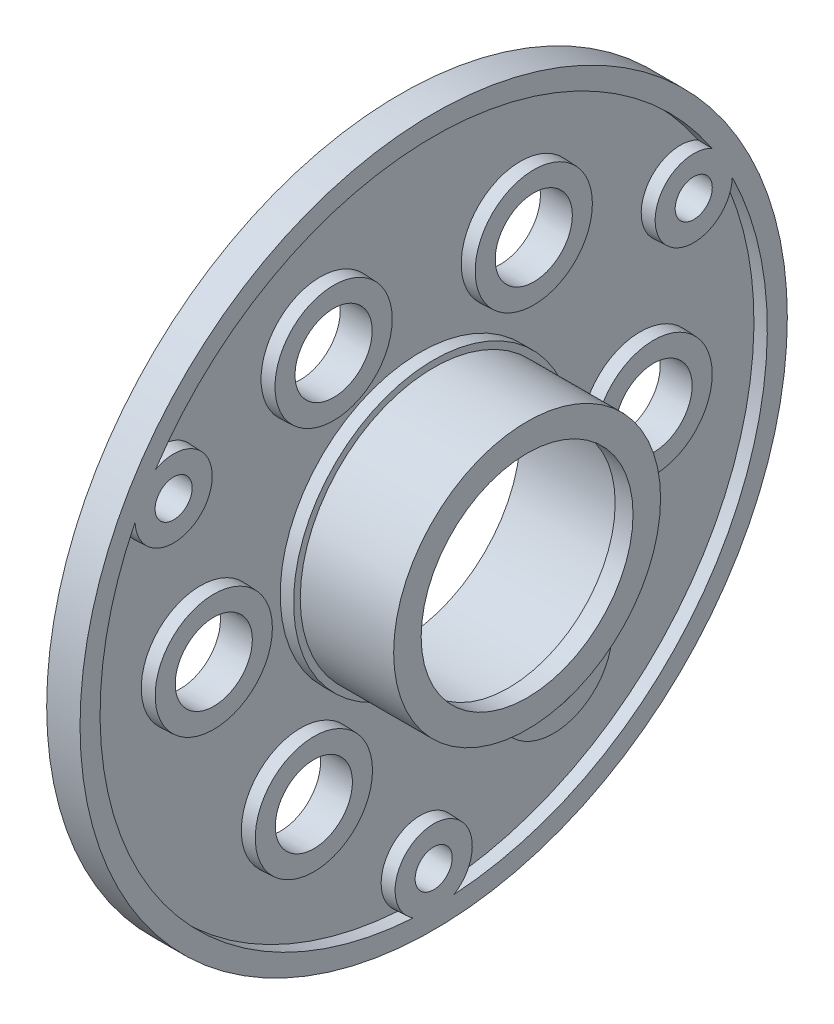
ISO-10303-21;
HEADER;
FILE_DESCRIPTION(('STEP AP214'),'2;1');
FILE_NAME('part.step','',(''),(''),'','','');
FILE_SCHEMA(('AUTOMOTIVE_DESIGN { 1 0 10303 214 1 1 1 1 }'));
ENDSEC;
DATA;
#1=APPLICATION_CONTEXT('core data for automotive mechanical design processes');
#2=APPLICATION_PROTOCOL_DEFINITION('international standard','automotive_design',2000,#1);
#3=PRODUCT_CONTEXT('',#1,'mechanical');
#4=PRODUCT('Part','Part','',(#3));
#5=PRODUCT_RELATED_PRODUCT_CATEGORY('part','',(#4));
#6=PRODUCT_DEFINITION_FORMATION('','',#4);
#7=PRODUCT_DEFINITION_CONTEXT('part definition',#1,'design');
#8=PRODUCT_DEFINITION('design','',#6,#7);
#9=PRODUCT_DEFINITION_SHAPE('','',#8);
#10=(LENGTH_UNIT() NAMED_UNIT(*) SI_UNIT(.MILLI.,.METRE.));
#11=(NAMED_UNIT(*) PLANE_ANGLE_UNIT() SI_UNIT($,.RADIAN.));
#12=(NAMED_UNIT(*) SI_UNIT($,.STERADIAN.) SOLID_ANGLE_UNIT());
#13=UNCERTAINTY_MEASURE_WITH_UNIT(LENGTH_MEASURE(1.E-05),#10,'distance_accuracy_value','');
#14=(GEOMETRIC_REPRESENTATION_CONTEXT(3) GLOBAL_UNCERTAINTY_ASSIGNED_CONTEXT((#13)) GLOBAL_UNIT_ASSIGNED_CONTEXT((#10,
#11,#12)) REPRESENTATION_CONTEXT('',''));
#15=CARTESIAN_POINT('',(0.,0.,0.));
#16=DIRECTION('',(0.,0.,1.));
#17=DIRECTION('',(1.,0.,0.));
#18=AXIS2_PLACEMENT_3D('',#15,#16,#17);
#19=CARTESIAN_POINT('',(1.25,0.,0.));
#20=DIRECTION('',(1.,0.,0.));
#21=DIRECTION('',(0.,0.,-1.));
#22=AXIS2_PLACEMENT_3D('',#19,#20,#21);
#23=PLANE('',#22);
#24=CARTESIAN_POINT('',(1.25,0.,0.));
#25=DIRECTION('',(1.,0.,0.));
#26=DIRECTION('',(0.,0.,-1.));
#27=AXIS2_PLACEMENT_3D('',#24,#25,#26);
#28=CIRCLE('',#27,10.);
#29=CARTESIAN_POINT('',(1.25,0.,-10.));
#30=VERTEX_POINT('',#29);
#31=EDGE_CURVE('E311',#30,#30,#28,.T.);
#32=ORIENTED_EDGE('',*,*,#31,.F.);
#33=EDGE_LOOP('',(#32));
#34=FACE_BOUND('',#33,.T.);
#35=CARTESIAN_POINT('',(1.25,0.,0.));
#36=DIRECTION('',(1.,0.,0.));
#37=DIRECTION('',(0.,0.,-1.));
#38=AXIS2_PLACEMENT_3D('',#35,#36,#37);
#39=CIRCLE('',#38,10.5);
#40=CARTESIAN_POINT('',(1.25,0.,-10.5));
#41=VERTEX_POINT('',#40);
#42=EDGE_CURVE('E98',#41,#41,#39,.T.);
#43=ORIENTED_EDGE('',*,*,#42,.T.);
#44=EDGE_LOOP('',(#43));
#45=FACE_BOUND('',#44,.T.);
#46=ADVANCED_FACE('F35',(#34,#45),#23,.T.);
#47=CARTESIAN_POINT('',(1.25,14.6969384566991,7.5));
#48=DIRECTION('',(1.,0.,0.));
#49=DIRECTION('',(0.,0.,-1.));
#50=AXIS2_PLACEMENT_3D('',#47,#48,#49);
#51=CIRCLE('',#50,2.89084764272872);
#52=CARTESIAN_POINT('',(1.25,14.6969384566991,4.60915235727128));
#53=VERTEX_POINT('',#52);
#54=EDGE_CURVE('E356',#53,#53,#51,.T.);
#55=ORIENTED_EDGE('',*,*,#54,.F.);
#56=EDGE_LOOP('',(#55));
#57=FACE_BOUND('',#56,.T.);
#58=CARTESIAN_POINT('',(1.25,14.6969384566991,7.5));
#59=DIRECTION('',(1.,0.,0.));
#60=DIRECTION('',(0.,0.,-1.));
#61=AXIS2_PLACEMENT_3D('',#58,#59,#60);
#62=CIRCLE('',#61,4.3922766704737);
#63=CARTESIAN_POINT('',(1.25,14.6969384566991,3.1077233295263));
#64=VERTEX_POINT('',#63);
#65=EDGE_CURVE('E150',#64,#64,#62,.T.);
#66=ORIENTED_EDGE('',*,*,#65,.T.);
#67=EDGE_LOOP('',(#66));
#68=FACE_BOUND('',#67,.T.);
#69=ADVANCED_FACE('F301',(#57,#68),#23,.T.);
#70=CARTESIAN_POINT('',(1.25,-13.8436597567328,-8.97792206135786));
#71=DIRECTION('',(1.,0.,0.));
#72=DIRECTION('',(0.,0.,-1.));
#73=AXIS2_PLACEMENT_3D('',#70,#71,#72);
#74=CIRCLE('',#73,2.89084764272872);
#75=CARTESIAN_POINT('',(1.25,-13.8436597567328,-11.8687697040866));
#76=VERTEX_POINT('',#75);
#77=EDGE_CURVE('E364',#76,#76,#74,.T.);
#78=ORIENTED_EDGE('',*,*,#77,.F.);
#79=EDGE_LOOP('',(#78));
#80=FACE_BOUND('',#79,.T.);
#81=CARTESIAN_POINT('',(1.25,-13.8436597567328,-8.97792206135786));
#82=DIRECTION('',(1.,0.,0.));
#83=DIRECTION('',(0.,0.,-1.));
#84=AXIS2_PLACEMENT_3D('',#81,#82,#83);
#85=CIRCLE('',#84,4.3922766704737);
#86=CARTESIAN_POINT('',(1.25,-13.8436597567328,-13.3701987318316));
#87=VERTEX_POINT('',#86);
#88=EDGE_CURVE('E116',#87,#87,#85,.T.);
#89=ORIENTED_EDGE('',*,*,#88,.T.);
#90=EDGE_LOOP('',(#89));
#91=FACE_BOUND('',#90,.T.);
#92=ADVANCED_FACE('F306',(#80,#91),#23,.T.);
#93=CARTESIAN_POINT('',(1.25,-0.853278699966242,-16.4779220613579));
#94=DIRECTION('',(1.,0.,0.));
#95=DIRECTION('',(0.,0.,-1.));
#96=AXIS2_PLACEMENT_3D('',#93,#94,#95);
#97=CIRCLE('',#96,2.89084764272872);
#98=CARTESIAN_POINT('',(1.25,-0.853278699966242,-19.3687697040866));
#99=VERTEX_POINT('',#98);
#100=EDGE_CURVE('E370',#99,#99,#97,.T.);
#101=ORIENTED_EDGE('',*,*,#100,.F.);
#102=EDGE_LOOP('',(#101));
#103=FACE_BOUND('',#102,.T.);
#104=CARTESIAN_POINT('',(1.25,-0.853278699966242,-16.4779220613579));
#105=DIRECTION('',(1.,0.,0.));
#106=DIRECTION('',(0.,0.,-1.));
#107=AXIS2_PLACEMENT_3D('',#104,#105,#106);
#108=CIRCLE('',#107,4.3922766704737);
#109=CARTESIAN_POINT('',(1.25,-0.853278699966242,-20.8701987318316));
#110=VERTEX_POINT('',#109);
#111=EDGE_CURVE('E128',#110,#110,#108,.T.);
#112=ORIENTED_EDGE('',*,*,#111,.T.);
#113=EDGE_LOOP('',(#112));
#114=FACE_BOUND('',#113,.T.);
#115=ADVANCED_FACE('F452',(#103,#114),#23,.T.);
#116=CARTESIAN_POINT('',(1.25,-13.8436597567328,8.97792206135785));
#117=DIRECTION('',(1.,0.,0.));
#118=DIRECTION('',(0.,0.,-1.));
#119=AXIS2_PLACEMENT_3D('',#116,#117,#118);
#120=CIRCLE('',#119,2.89084764272872);
#121=CARTESIAN_POINT('',(1.25,-13.8436597567328,6.08707441862912));
#122=VERTEX_POINT('',#121);
#123=EDGE_CURVE('E332',#122,#122,#120,.T.);
#124=ORIENTED_EDGE('',*,*,#123,.F.);
#125=EDGE_LOOP('',(#124));
#126=FACE_BOUND('',#125,.T.);
#127=CARTESIAN_POINT('',(1.25,-13.8436597567328,8.97792206135785));
#128=DIRECTION('',(1.,0.,0.));
#129=DIRECTION('',(0.,0.,-1.));
#130=AXIS2_PLACEMENT_3D('',#127,#128,#129);
#131=CIRCLE('',#130,4.3922766704737);
#132=CARTESIAN_POINT('',(1.25,-13.8436597567328,4.58564539088415));
#133=VERTEX_POINT('',#132);
#134=EDGE_CURVE('E140',#133,#133,#131,.T.);
#135=ORIENTED_EDGE('',*,*,#134,.T.);
#136=EDGE_LOOP('',(#135));
#137=FACE_BOUND('',#136,.T.);
#138=ADVANCED_FACE('F397',(#126,#137),#23,.T.);
#139=CARTESIAN_POINT('',(1.25,-0.85327869996625,16.4779220613579));
#140=DIRECTION('',(1.,0.,0.));
#141=DIRECTION('',(0.,0.,-1.));
#142=AXIS2_PLACEMENT_3D('',#139,#140,#141);
#143=CIRCLE('',#142,2.89084764272872);
#144=CARTESIAN_POINT('',(1.25,-0.85327869996625,13.5870744186291));
#145=VERTEX_POINT('',#144);
#146=EDGE_CURVE('E345',#145,#145,#143,.T.);
#147=ORIENTED_EDGE('',*,*,#146,.F.);
#148=EDGE_LOOP('',(#147));
#149=FACE_BOUND('',#148,.T.);
#150=CARTESIAN_POINT('',(1.25,-0.85327869996625,16.4779220613579));
#151=DIRECTION('',(1.,0.,0.));
#152=DIRECTION('',(0.,0.,-1.));
#153=AXIS2_PLACEMENT_3D('',#150,#151,#152);
#154=CIRCLE('',#153,4.3922766704737);
#155=CARTESIAN_POINT('',(1.25,-0.85327869996625,12.0856453908842));
#156=VERTEX_POINT('',#155);
#157=EDGE_CURVE('E144',#156,#156,#154,.T.);
#158=ORIENTED_EDGE('',*,*,#157,.T.);
#159=EDGE_LOOP('',(#158));
#160=FACE_BOUND('',#159,.T.);
#161=ADVANCED_FACE('F390',(#149,#160),#23,.T.);
#162=CARTESIAN_POINT('',(1.25,14.6969384566991,-7.5));
#163=DIRECTION('',(1.,0.,0.));
#164=DIRECTION('',(0.,0.,-1.));
#165=AXIS2_PLACEMENT_3D('',#162,#163,#164);
#166=CIRCLE('',#165,2.89084764272872);
#167=CARTESIAN_POINT('',(1.25,14.6969384566991,-10.3908476427287));
#168=VERTEX_POINT('',#167);
#169=EDGE_CURVE('E379',#168,#168,#166,.T.);
#170=ORIENTED_EDGE('',*,*,#169,.F.);
#171=EDGE_LOOP('',(#170));
#172=FACE_BOUND('',#171,.T.);
#173=CARTESIAN_POINT('',(1.25,14.6969384566991,-7.5));
#174=DIRECTION('',(1.,0.,0.));
#175=DIRECTION('',(0.,0.,-1.));
#176=AXIS2_PLACEMENT_3D('',#173,#174,#175);
#177=CIRCLE('',#176,4.3922766704737);
#178=CARTESIAN_POINT('',(1.25,14.6969384566991,-11.8922766704737));
#179=VERTEX_POINT('',#178);
#180=EDGE_CURVE('E109',#179,#179,#177,.T.);
#181=ORIENTED_EDGE('',*,*,#180,.T.);
#182=EDGE_LOOP('',(#181));
#183=FACE_BOUND('',#182,.T.);
#184=ADVANCED_FACE('F293',(#172,#183),#23,.T.);
#185=CARTESIAN_POINT('',(1.25,0.,0.));
#186=DIRECTION('',(-1.,0.,0.));
#187=DIRECTION('',(0.,0.,1.));
#188=AXIS2_PLACEMENT_3D('',#185,#186,#187);
#189=CYLINDRICAL_SURFACE('',#188,26.5);
#190=CARTESIAN_POINT('',(1.25,0.,0.));
#191=DIRECTION('',(1.,0.,0.));
#192=DIRECTION('',(0.,0.,-1.));
#193=AXIS2_PLACEMENT_3D('',#190,#191,#192);
#194=CIRCLE('',#193,26.5);
#195=CARTESIAN_POINT('',(1.25,0.,-26.5));
#196=VERTEX_POINT('',#195);
#197=EDGE_CURVE('E11',#196,#196,#194,.T.);
#198=ORIENTED_EDGE('',*,*,#197,.F.);
#199=EDGE_LOOP('',(#198));
#200=FACE_BOUND('',#199,.T.);
#201=CARTESIAN_POINT('',(-1.25,0.,0.));
#202=DIRECTION('',(1.,0.,0.));
#203=DIRECTION('',(0.,0.,-1.));
#204=AXIS2_PLACEMENT_3D('',#201,#202,#203);
#205=CIRCLE('',#204,26.5);
#206=CARTESIAN_POINT('',(-1.25,0.,-26.5));
#207=VERTEX_POINT('',#206);
#208=EDGE_CURVE('E44',#207,#207,#205,.T.);
#209=ORIENTED_EDGE('',*,*,#208,.T.);
#210=EDGE_LOOP('',(#209));
#211=FACE_BOUND('',#210,.T.);
#212=ADVANCED_FACE('F37',(#200,#211),#189,.T.);
#213=CARTESIAN_POINT('',(1.25,0.,0.));
#214=DIRECTION('',(1.,0.,0.));
#215=DIRECTION('',(0.,0.,-1.));
#216=AXIS2_PLACEMENT_3D('',#213,#214,#215);
#217=CIRCLE('',#216,25.);
#218=CARTESIAN_POINT('',(1.25,11.1494465295858,22.376099796075));
#219=VERTEX_POINT('',#218);
#220=CARTESIAN_POINT('',(1.25,-24.9529941258096,1.53234596528005));
#221=VERTEX_POINT('',#220);
#222=EDGE_CURVE('E152',#219,#221,#217,.T.);
#223=ORIENTED_EDGE('',*,*,#222,.F.);
#224=CARTESIAN_POINT('',(1.25,11.25,19.4855715851498));
#225=DIRECTION('',(1.,0.,0.));
#226=DIRECTION('',(0.,0.,-1.));
#227=AXIS2_PLACEMENT_3D('',#224,#225,#226);
#228=CIRCLE('',#227,2.8922766704737);
#229=CARTESIAN_POINT('',(1.25,13.8035475962239,20.843753830795));
#230=VERTEX_POINT('',#229);
#231=EDGE_CURVE('E135',#219,#230,#228,.T.);
#232=ORIENTED_EDGE('',*,*,#231,.T.);
#233=CARTESIAN_POINT('',(1.25,13.8035475962238,-20.8437538307951));
#234=VERTEX_POINT('',#233);
#235=EDGE_CURVE('E52',#234,#230,#217,.T.);
#236=ORIENTED_EDGE('',*,*,#235,.F.);
#237=CARTESIAN_POINT('',(1.25,11.25,-19.4855715851499));
#238=DIRECTION('',(1.,0.,0.));
#239=DIRECTION('',(0.,0.,-1.));
#240=AXIS2_PLACEMENT_3D('',#237,#238,#239);
#241=CIRCLE('',#240,2.8922766704737);
#242=CARTESIAN_POINT('',(1.25,11.1494465295857,-22.376099796075));
#243=VERTEX_POINT('',#242);
#244=EDGE_CURVE('E97',#234,#243,#241,.T.);
#245=ORIENTED_EDGE('',*,*,#244,.T.);
#246=CARTESIAN_POINT('',(1.25,-24.9529941258096,-1.53234596527994));
#247=VERTEX_POINT('',#246);
#248=EDGE_CURVE('E153',#247,#243,#217,.T.);
#249=ORIENTED_EDGE('',*,*,#248,.F.);
#250=CARTESIAN_POINT('',(1.25,-22.5,0.));
#251=DIRECTION('',(1.,0.,0.));
#252=DIRECTION('',(0.,0.,-1.));
#253=AXIS2_PLACEMENT_3D('',#250,#251,#252);
#254=CIRCLE('',#253,2.8922766704737);
#255=EDGE_CURVE('E132',#247,#221,#254,.T.);
#256=ORIENTED_EDGE('',*,*,#255,.T.);
#257=EDGE_LOOP('',(#223,#232,#236,#245,#249,#256));
#258=FACE_BOUND('',#257,.T.);
#259=CARTESIAN_POINT('',(1.25,11.25,-19.4855715851499));
#260=DIRECTION('',(1.,0.,0.));
#261=DIRECTION('',(0.,0.,-1.));
#262=AXIS2_PLACEMENT_3D('',#259,#260,#261);
#263=CIRCLE('',#262,1.39084764272872);
#264=CARTESIAN_POINT('',(1.25,11.25,-20.8764192278786));
#265=VERTEX_POINT('',#264);
#266=EDGE_CURVE('E357',#265,#265,#263,.T.);
#267=ORIENTED_EDGE('',*,*,#266,.F.);
#268=EDGE_LOOP('',(#267));
#269=FACE_BOUND('',#268,.T.);
#270=CARTESIAN_POINT('',(1.25,11.25,19.4855715851498));
#271=DIRECTION('',(1.,0.,0.));
#272=DIRECTION('',(0.,0.,-1.));
#273=AXIS2_PLACEMENT_3D('',#270,#271,#272);
#274=CIRCLE('',#273,1.39084764272872);
#275=CARTESIAN_POINT('',(1.25,11.25,18.0947239424211));
#276=VERTEX_POINT('',#275);
#277=EDGE_CURVE('E333',#276,#276,#274,.T.);
#278=ORIENTED_EDGE('',*,*,#277,.F.);
#279=EDGE_LOOP('',(#278));
#280=FACE_BOUND('',#279,.T.);
#281=CARTESIAN_POINT('',(1.25,-22.5,0.));
#282=DIRECTION('',(1.,0.,0.));
#283=DIRECTION('',(0.,0.,-1.));
#284=AXIS2_PLACEMENT_3D('',#281,#282,#283);
#285=CIRCLE('',#284,1.39084764272872);
#286=CARTESIAN_POINT('',(1.25,-22.5,-1.39084764272867));
#287=VERTEX_POINT('',#286);
#288=EDGE_CURVE('E344',#287,#287,#285,.T.);
#289=ORIENTED_EDGE('',*,*,#288,.F.);
#290=EDGE_LOOP('',(#289));
#291=FACE_BOUND('',#290,.T.);
#292=ORIENTED_EDGE('',*,*,#197,.T.);
#293=EDGE_LOOP('',(#292));
#294=FACE_BOUND('',#293,.T.);
#295=ADVANCED_FACE('F290',(#258,#269,#280,#291,#294),#23,.T.);
#296=CARTESIAN_POINT('',(-1.25,0.,0.));
#297=DIRECTION('',(1.,0.,0.));
#298=DIRECTION('',(0.,0.,-1.));
#299=AXIS2_PLACEMENT_3D('',#296,#297,#298);
#300=PLANE('',#299);
#301=CARTESIAN_POINT('',(-1.25,0.,0.));
#302=DIRECTION('',(1.,0.,0.));
#303=DIRECTION('',(0.,0.,-1.));
#304=AXIS2_PLACEMENT_3D('',#301,#302,#303);
#305=CIRCLE('',#304,9.);
#306=CARTESIAN_POINT('',(-1.25,0.,-9.));
#307=VERTEX_POINT('',#306);
#308=EDGE_CURVE('E319',#307,#307,#305,.T.);
#309=ORIENTED_EDGE('',*,*,#308,.T.);
#310=EDGE_LOOP('',(#309));
#311=FACE_BOUND('',#310,.T.);
#312=CARTESIAN_POINT('',(-1.25,14.6969384566991,7.5));
#313=DIRECTION('',(1.,0.,0.));
#314=DIRECTION('',(0.,0.,-1.));
#315=AXIS2_PLACEMENT_3D('',#312,#313,#314);
#316=CIRCLE('',#315,3.);
#317=CARTESIAN_POINT('',(-1.25,14.6969384566991,4.5));
#318=VERTEX_POINT('',#317);
#319=EDGE_CURVE('E353',#318,#318,#316,.T.);
#320=ORIENTED_EDGE('',*,*,#319,.T.);
#321=EDGE_LOOP('',(#320));
#322=FACE_BOUND('',#321,.T.);
#323=CARTESIAN_POINT('',(-1.25,11.25,-19.4855715851499));
#324=DIRECTION('',(1.,0.,0.));
#325=DIRECTION('',(0.,0.,-1.));
#326=AXIS2_PLACEMENT_3D('',#323,#324,#325);
#327=CIRCLE('',#326,1.5);
#328=CARTESIAN_POINT('',(-1.25,11.25,-20.9855715851499));
#329=VERTEX_POINT('',#328);
#330=EDGE_CURVE('E361',#329,#329,#327,.T.);
#331=ORIENTED_EDGE('',*,*,#330,.T.);
#332=EDGE_LOOP('',(#331));
#333=FACE_BOUND('',#332,.T.);
#334=CARTESIAN_POINT('',(-1.25,-13.8436597567328,-8.97792206135786));
#335=DIRECTION('',(1.,0.,0.));
#336=DIRECTION('',(0.,0.,-1.));
#337=AXIS2_PLACEMENT_3D('',#334,#335,#336);
#338=CIRCLE('',#337,3.);
#339=CARTESIAN_POINT('',(-1.25,-13.8436597567328,-11.9779220613579));
#340=VERTEX_POINT('',#339);
#341=EDGE_CURVE('E367',#340,#340,#338,.T.);
#342=ORIENTED_EDGE('',*,*,#341,.T.);
#343=EDGE_LOOP('',(#342));
#344=FACE_BOUND('',#343,.T.);
#345=CARTESIAN_POINT('',(-1.25,-0.853278699966242,-16.4779220613579));
#346=DIRECTION('',(1.,0.,0.));
#347=DIRECTION('',(0.,0.,-1.));
#348=AXIS2_PLACEMENT_3D('',#345,#346,#347);
#349=CIRCLE('',#348,3.);
#350=CARTESIAN_POINT('',(-1.25,-0.853278699966242,-19.4779220613579));
#351=VERTEX_POINT('',#350);
#352=EDGE_CURVE('E348',#351,#351,#349,.T.);
#353=ORIENTED_EDGE('',*,*,#352,.T.);
#354=EDGE_LOOP('',(#353));
#355=FACE_BOUND('',#354,.T.);
#356=CARTESIAN_POINT('',(-1.25,11.25,19.4855715851498));
#357=DIRECTION('',(1.,0.,0.));
#358=DIRECTION('',(0.,0.,-1.));
#359=AXIS2_PLACEMENT_3D('',#356,#357,#358);
#360=CIRCLE('',#359,1.5);
#361=CARTESIAN_POINT('',(-1.25,11.25,17.9855715851498));
#362=VERTEX_POINT('',#361);
#363=EDGE_CURVE('E327',#362,#362,#360,.T.);
#364=ORIENTED_EDGE('',*,*,#363,.T.);
#365=EDGE_LOOP('',(#364));
#366=FACE_BOUND('',#365,.T.);
#367=CARTESIAN_POINT('',(-1.25,-13.8436597567328,8.97792206135785));
#368=DIRECTION('',(1.,0.,0.));
#369=DIRECTION('',(0.,0.,-1.));
#370=AXIS2_PLACEMENT_3D('',#367,#368,#369);
#371=CIRCLE('',#370,3.);
#372=CARTESIAN_POINT('',(-1.25,-13.8436597567328,5.97792206135784));
#373=VERTEX_POINT('',#372);
#374=EDGE_CURVE('E329',#373,#373,#371,.T.);
#375=ORIENTED_EDGE('',*,*,#374,.T.);
#376=EDGE_LOOP('',(#375));
#377=FACE_BOUND('',#376,.T.);
#378=CARTESIAN_POINT('',(-1.25,-0.85327869996625,16.4779220613579));
#379=DIRECTION('',(1.,0.,0.));
#380=DIRECTION('',(0.,0.,-1.));
#381=AXIS2_PLACEMENT_3D('',#378,#379,#380);
#382=CIRCLE('',#381,3.);
#383=CARTESIAN_POINT('',(-1.25,-0.85327869996625,13.4779220613579));
#384=VERTEX_POINT('',#383);
#385=EDGE_CURVE('E336',#384,#384,#382,.T.);
#386=ORIENTED_EDGE('',*,*,#385,.T.);
#387=EDGE_LOOP('',(#386));
#388=FACE_BOUND('',#387,.T.);
#389=CARTESIAN_POINT('',(-1.25,-22.5,0.));
#390=DIRECTION('',(1.,0.,0.));
#391=DIRECTION('',(0.,0.,-1.));
#392=AXIS2_PLACEMENT_3D('',#389,#390,#391);
#393=CIRCLE('',#392,1.5);
#394=CARTESIAN_POINT('',(-1.25,-22.5,-1.49999999999995));
#395=VERTEX_POINT('',#394);
#396=EDGE_CURVE('E341',#395,#395,#393,.T.);
#397=ORIENTED_EDGE('',*,*,#396,.T.);
#398=EDGE_LOOP('',(#397));
#399=FACE_BOUND('',#398,.T.);
#400=CARTESIAN_POINT('',(-1.25,14.6969384566991,-7.5));
#401=DIRECTION('',(1.,0.,0.));
#402=DIRECTION('',(0.,0.,-1.));
#403=AXIS2_PLACEMENT_3D('',#400,#401,#402);
#404=CIRCLE('',#403,3.);
#405=CARTESIAN_POINT('',(-1.25,14.6969384566991,-10.5));
#406=VERTEX_POINT('',#405);
#407=EDGE_CURVE('E360',#406,#406,#404,.T.);
#408=ORIENTED_EDGE('',*,*,#407,.T.);
#409=EDGE_LOOP('',(#408));
#410=FACE_BOUND('',#409,.T.);
#411=ORIENTED_EDGE('',*,*,#208,.F.);
#412=EDGE_LOOP('',(#411));
#413=FACE_BOUND('',#412,.T.);
#414=ADVANCED_FACE('F288',(#311,#322,#333,#344,#355,#366,#377,#388,#399,#410,#413),#300,.F.);
#415=CARTESIAN_POINT('',(-1.25,14.6969384566991,-7.5));
#416=DIRECTION('',(-1.,0.,0.));
#417=DIRECTION('',(0.,0.,-1.));
#418=AXIS2_PLACEMENT_3D('',#415,#416,#417);
#419=CONICAL_SURFACE('',#418,3.,0.0436332312998583);
#420=ORIENTED_EDGE('',*,*,#169,.T.);
#421=EDGE_LOOP('',(#420));
#422=FACE_BOUND('',#421,.T.);
#423=ORIENTED_EDGE('',*,*,#407,.F.);
#424=EDGE_LOOP('',(#423));
#425=FACE_BOUND('',#424,.T.);
#426=ADVANCED_FACE('F267',(#422,#425),#419,.F.);
#427=CARTESIAN_POINT('',(-1.25,-22.5,0.));
#428=DIRECTION('',(-1.,0.,0.));
#429=DIRECTION('',(0.,0.,-1.));
#430=AXIS2_PLACEMENT_3D('',#427,#428,#429);
#431=CONICAL_SURFACE('',#430,1.5,0.0436332312998583);
#432=ORIENTED_EDGE('',*,*,#288,.T.);
#433=EDGE_LOOP('',(#432));
#434=FACE_BOUND('',#433,.T.);
#435=ORIENTED_EDGE('',*,*,#396,.F.);
#436=EDGE_LOOP('',(#435));
#437=FACE_BOUND('',#436,.T.);
#438=ADVANCED_FACE('F264',(#434,#437),#431,.F.);
#439=CARTESIAN_POINT('',(-1.25,-0.85327869996625,16.4779220613579));
#440=DIRECTION('',(-1.,0.,0.));
#441=DIRECTION('',(0.,0.,-1.));
#442=AXIS2_PLACEMENT_3D('',#439,#440,#441);
#443=CONICAL_SURFACE('',#442,3.,0.0436332312998583);
#444=ORIENTED_EDGE('',*,*,#146,.T.);
#445=EDGE_LOOP('',(#444));
#446=FACE_BOUND('',#445,.T.);
#447=ORIENTED_EDGE('',*,*,#385,.F.);
#448=EDGE_LOOP('',(#447));
#449=FACE_BOUND('',#448,.T.);
#450=ADVANCED_FACE('F258',(#446,#449),#443,.F.);
#451=CARTESIAN_POINT('',(-1.25,-13.8436597567328,8.97792206135785));
#452=DIRECTION('',(-1.,0.,0.));
#453=DIRECTION('',(0.,0.,-1.));
#454=AXIS2_PLACEMENT_3D('',#451,#452,#453);
#455=CONICAL_SURFACE('',#454,3.,0.0436332312998583);
#456=ORIENTED_EDGE('',*,*,#123,.T.);
#457=EDGE_LOOP('',(#456));
#458=FACE_BOUND('',#457,.T.);
#459=ORIENTED_EDGE('',*,*,#374,.F.);
#460=EDGE_LOOP('',(#459));
#461=FACE_BOUND('',#460,.T.);
#462=ADVANCED_FACE('F254',(#458,#461),#455,.F.);
#463=CARTESIAN_POINT('',(-1.25,11.25,19.4855715851498));
#464=DIRECTION('',(-1.,0.,0.));
#465=DIRECTION('',(0.,0.,-1.));
#466=AXIS2_PLACEMENT_3D('',#463,#464,#465);
#467=CONICAL_SURFACE('',#466,1.5,0.0436332312998583);
#468=ORIENTED_EDGE('',*,*,#277,.T.);
#469=EDGE_LOOP('',(#468));
#470=FACE_BOUND('',#469,.T.);
#471=ORIENTED_EDGE('',*,*,#363,.F.);
#472=EDGE_LOOP('',(#471));
#473=FACE_BOUND('',#472,.T.);
#474=ADVANCED_FACE('F257',(#470,#473),#467,.F.);
#475=CARTESIAN_POINT('',(-1.25,-0.853278699966242,-16.4779220613579));
#476=DIRECTION('',(-1.,0.,0.));
#477=DIRECTION('',(0.,0.,-1.));
#478=AXIS2_PLACEMENT_3D('',#475,#476,#477);
#479=CONICAL_SURFACE('',#478,3.,0.0436332312998583);
#480=ORIENTED_EDGE('',*,*,#100,.T.);
#481=EDGE_LOOP('',(#480));
#482=FACE_BOUND('',#481,.T.);
#483=ORIENTED_EDGE('',*,*,#352,.F.);
#484=EDGE_LOOP('',(#483));
#485=FACE_BOUND('',#484,.T.);
#486=ADVANCED_FACE('F262',(#482,#485),#479,.F.);
#487=CARTESIAN_POINT('',(-1.25,-13.8436597567328,-8.97792206135786));
#488=DIRECTION('',(-1.,0.,0.));
#489=DIRECTION('',(0.,0.,-1.));
#490=AXIS2_PLACEMENT_3D('',#487,#488,#489);
#491=CONICAL_SURFACE('',#490,3.,0.0436332312998583);
#492=ORIENTED_EDGE('',*,*,#77,.T.);
#493=EDGE_LOOP('',(#492));
#494=FACE_BOUND('',#493,.T.);
#495=ORIENTED_EDGE('',*,*,#341,.F.);
#496=EDGE_LOOP('',(#495));
#497=FACE_BOUND('',#496,.T.);
#498=ADVANCED_FACE('F278',(#494,#497),#491,.F.);
#499=CARTESIAN_POINT('',(-1.25,11.25,-19.4855715851499));
#500=DIRECTION('',(-1.,0.,0.));
#501=DIRECTION('',(0.,0.,-1.));
#502=AXIS2_PLACEMENT_3D('',#499,#500,#501);
#503=CONICAL_SURFACE('',#502,1.5,0.0436332312998583);
#504=ORIENTED_EDGE('',*,*,#266,.T.);
#505=EDGE_LOOP('',(#504));
#506=FACE_BOUND('',#505,.T.);
#507=ORIENTED_EDGE('',*,*,#330,.F.);
#508=EDGE_LOOP('',(#507));
#509=FACE_BOUND('',#508,.T.);
#510=ADVANCED_FACE('F274',(#506,#509),#503,.F.);
#511=CARTESIAN_POINT('',(-1.25,14.6969384566991,7.5));
#512=DIRECTION('',(-1.,0.,0.));
#513=DIRECTION('',(0.,0.,-1.));
#514=AXIS2_PLACEMENT_3D('',#511,#512,#513);
#515=CONICAL_SURFACE('',#514,3.,0.0436332312998583);
#516=ORIENTED_EDGE('',*,*,#54,.T.);
#517=EDGE_LOOP('',(#516));
#518=FACE_BOUND('',#517,.T.);
#519=ORIENTED_EDGE('',*,*,#319,.F.);
#520=EDGE_LOOP('',(#519));
#521=FACE_BOUND('',#520,.T.);
#522=ADVANCED_FACE('F252',(#518,#521),#515,.F.);
#523=CARTESIAN_POINT('',(8.25,0.,0.));
#524=DIRECTION('',(-1.,0.,0.));
#525=DIRECTION('',(0.,0.,1.));
#526=AXIS2_PLACEMENT_3D('',#523,#524,#525);
#527=CYLINDRICAL_SURFACE('',#526,10.);
#528=CARTESIAN_POINT('',(8.25,0.,0.));
#529=DIRECTION('',(1.,0.,0.));
#530=DIRECTION('',(0.,0.,-1.));
#531=AXIS2_PLACEMENT_3D('',#528,#529,#530);
#532=CIRCLE('',#531,10.);
#533=CARTESIAN_POINT('',(8.25,0.,-10.));
#534=VERTEX_POINT('',#533);
#535=EDGE_CURVE('E324',#534,#534,#532,.T.);
#536=ORIENTED_EDGE('',*,*,#535,.F.);
#537=EDGE_LOOP('',(#536));
#538=FACE_BOUND('',#537,.T.);
#539=ORIENTED_EDGE('',*,*,#31,.T.);
#540=EDGE_LOOP('',(#539));
#541=FACE_BOUND('',#540,.T.);
#542=ADVANCED_FACE('F248',(#538,#541),#527,.T.);
#543=CARTESIAN_POINT('',(8.25,0.,0.));
#544=DIRECTION('',(1.,0.,0.));
#545=DIRECTION('',(0.,0.,-1.));
#546=AXIS2_PLACEMENT_3D('',#543,#544,#545);
#547=PLANE('',#546);
#548=CARTESIAN_POINT('',(8.25,0.,0.));
#549=DIRECTION('',(1.,0.,0.));
#550=DIRECTION('',(0.,0.,-1.));
#551=AXIS2_PLACEMENT_3D('',#548,#549,#550);
#552=CIRCLE('',#551,7.93887467992808);
#553=CARTESIAN_POINT('',(8.25,0.,-7.93887467992808));
#554=VERTEX_POINT('',#553);
#555=EDGE_CURVE('E39',#554,#554,#552,.T.);
#556=ORIENTED_EDGE('',*,*,#555,.F.);
#557=EDGE_LOOP('',(#556));
#558=FACE_BOUND('',#557,.T.);
#559=ORIENTED_EDGE('',*,*,#535,.T.);
#560=EDGE_LOOP('',(#559));
#561=FACE_BOUND('',#560,.T.);
#562=ADVANCED_FACE('F244',(#558,#561),#547,.T.);
#563=CARTESIAN_POINT('',(6.85,0.,0.));
#564=DIRECTION('',(-1.,0.,0.));
#565=DIRECTION('',(0.,0.,1.));
#566=AXIS2_PLACEMENT_3D('',#563,#564,#565);
#567=CYLINDRICAL_SURFACE('',#566,9.);
#568=CARTESIAN_POINT('',(6.85,0.,0.));
#569=DIRECTION('',(1.,0.,0.));
#570=DIRECTION('',(0.,0.,-1.));
#571=AXIS2_PLACEMENT_3D('',#568,#569,#570);
#572=CIRCLE('',#571,9.);
#573=CARTESIAN_POINT('',(6.85,0.,-9.));
#574=VERTEX_POINT('',#573);
#575=EDGE_CURVE('E321',#574,#574,#572,.T.);
#576=ORIENTED_EDGE('',*,*,#575,.T.);
#577=EDGE_LOOP('',(#576));
#578=FACE_BOUND('',#577,.T.);
#579=ORIENTED_EDGE('',*,*,#308,.F.);
#580=EDGE_LOOP('',(#579));
#581=FACE_BOUND('',#580,.T.);
#582=ADVANCED_FACE('F240',(#578,#581),#567,.F.);
#583=CARTESIAN_POINT('',(6.85,0.,0.));
#584=DIRECTION('',(1.,0.,0.));
#585=DIRECTION('',(0.,0.,-1.));
#586=AXIS2_PLACEMENT_3D('',#583,#584,#585);
#587=PLANE('',#586);
#588=CARTESIAN_POINT('',(6.85,0.,0.));
#589=DIRECTION('',(-1.,0.,0.));
#590=DIRECTION('',(0.,0.,1.));
#591=AXIS2_PLACEMENT_3D('',#588,#589,#590);
#592=CIRCLE('',#591,8.);
#593=CARTESIAN_POINT('',(6.85,0.,8.));
#594=VERTEX_POINT('',#593);
#595=EDGE_CURVE('E315',#594,#594,#592,.T.);
#596=ORIENTED_EDGE('',*,*,#595,.F.);
#597=EDGE_LOOP('',(#596));
#598=FACE_BOUND('',#597,.T.);
#599=ORIENTED_EDGE('',*,*,#575,.F.);
#600=EDGE_LOOP('',(#599));
#601=FACE_BOUND('',#600,.T.);
#602=ADVANCED_FACE('F236',(#598,#601),#587,.F.);
#603=CARTESIAN_POINT('',(6.85,0.,0.));
#604=DIRECTION('',(-1.,0.,0.));
#605=DIRECTION('',(0.,0.,1.));
#606=AXIS2_PLACEMENT_3D('',#603,#604,#605);
#607=CONICAL_SURFACE('',#606,8.,0.0436332312998583);
#608=ORIENTED_EDGE('',*,*,#555,.T.);
#609=EDGE_LOOP('',(#608));
#610=FACE_BOUND('',#609,.T.);
#611=ORIENTED_EDGE('',*,*,#595,.T.);
#612=EDGE_LOOP('',(#611));
#613=FACE_BOUND('',#612,.T.);
#614=ADVANCED_FACE('F232',(#610,#613),#607,.F.);
#615=CARTESIAN_POINT('',(6.85,0.,0.));
#616=DIRECTION('',(-1.,0.,0.));
#617=DIRECTION('',(0.,0.,1.));
#618=AXIS2_PLACEMENT_3D('',#615,#616,#617);
#619=CYLINDRICAL_SURFACE('',#618,10.5);
#620=CARTESIAN_POINT('',(0.25,0.,0.));
#621=DIRECTION('',(1.,0.,0.));
#622=DIRECTION('',(0.,0.,-1.));
#623=AXIS2_PLACEMENT_3D('',#620,#621,#622);
#624=CIRCLE('',#623,10.5);
#625=CARTESIAN_POINT('',(0.25,0.,-10.5));
#626=VERTEX_POINT('',#625);
#627=EDGE_CURVE('E136',#626,#626,#624,.T.);
#628=ORIENTED_EDGE('',*,*,#627,.T.);
#629=EDGE_LOOP('',(#628));
#630=FACE_BOUND('',#629,.T.);
#631=ORIENTED_EDGE('',*,*,#42,.F.);
#632=EDGE_LOOP('',(#631));
#633=FACE_BOUND('',#632,.T.);
#634=ADVANCED_FACE('F229',(#630,#633),#619,.T.);
#635=CARTESIAN_POINT('',(1.25,0.,0.));
#636=DIRECTION('',(-1.,0.,0.));
#637=DIRECTION('',(0.,0.,1.));
#638=AXIS2_PLACEMENT_3D('',#635,#636,#637);
#639=CYLINDRICAL_SURFACE('',#638,25.);
#640=CARTESIAN_POINT('',(-4.27399055706482,14.1834538574184,-20.5871230791114));
#641=CARTESIAN_POINT('',(-3.81337561817886,14.1544644847514,-20.607094118756));
#642=CARTESIAN_POINT('',(-3.35280312404052,14.1249675009718,-20.6273267905783));
#643=CARTESIAN_POINT('',(-2.43176790005842,14.0647316437252,-20.6684461425167));
#644=CARTESIAN_POINT('',(-1.97130517040248,14.0339927681483,-20.689332823744));
#645=CARTESIAN_POINT('',(-1.05059748417598,13.9710521329368,-20.7318871014284));
#646=CARTESIAN_POINT('',(-0.590352503476064,13.9388506334481,-20.7535545588743));
#647=CARTESIAN_POINT('',(0.329967084931534,13.8726556187614,-20.7978608201185));
#648=CARTESIAN_POINT('',(0.790041690917849,13.8386620859297,-20.8204996334745));
#649=CARTESIAN_POINT('',(1.71003770709446,13.768427045054,-20.8670120422556));
#650=CARTESIAN_POINT('',(2.16995907713095,13.7321851499773,-20.8908858501543));
#651=CARTESIAN_POINT('',(3.08947001646139,13.656805099207,-20.9402414730442));
#652=CARTESIAN_POINT('',(3.54905959378927,13.61766701619,-20.965723247683));
#653=CARTESIAN_POINT('',(4.23812392800908,13.5559862300608,-21.0056143163347));
#654=CARTESIAN_POINT('',(4.46777973476308,13.5349282914044,-21.0191907278052));
#655=CARTESIAN_POINT('',(4.92693596557529,13.4916155060896,-21.0470181621651));
#656=CARTESIAN_POINT('',(5.15643639095493,13.469360669743,-21.0612691792424));
#657=CARTESIAN_POINT('',(5.61525990749929,13.4233974792669,-21.0905938773296));
#658=CARTESIAN_POINT('',(5.84458298241744,13.3996890050067,-21.1056676263198));
#659=CARTESIAN_POINT('',(6.30296143800138,13.3503996462475,-21.1368791381549));
#660=CARTESIAN_POINT('',(6.53201681057147,13.3248187065386,-21.1530169323718));
#661=CARTESIAN_POINT('',(6.76089589226942,13.298091937901,-21.1698075289109));
#662=B_SPLINE_CURVE_WITH_KNOTS('',3,(#640,#641,#642,#643,#644,#645,#646,#647,#648,#649,#650,
#651,#652,#653,#654,#655,#656,#657,#658,#659,#660,#661),.UNSPECIFIED.,.F.,.F.,(4,2,2,2,2,2,2,2,
2,2,4),(0.,1.38587541008666,2.77175317476533,4.1573854018603,5.54303126612652,6.92891632060895,
8.31476660965759,9.00781880647942,9.70086503332202,10.3939686118598,11.0870926348646),.UNSPECIFIED.);
#663=CARTESIAN_POINT('',(0.25,13.8781962332564,-20.794125836669));
#664=VERTEX_POINT('',#663);
#665=EDGE_CURVE('E91',#664,#234,#662,.T.);
#666=ORIENTED_EDGE('',*,*,#665,.T.);
#667=ORIENTED_EDGE('',*,*,#235,.T.);
#668=CARTESIAN_POINT('',(-4.27399055706482,14.1834538574185,20.5871230791114));
#669=CARTESIAN_POINT('',(-3.81337561817887,14.1544644847515,20.6070941187559));
#670=CARTESIAN_POINT('',(-3.35280312404052,14.1249675009719,20.6273267905782));
#671=CARTESIAN_POINT('',(-2.43176790005842,14.0647316437253,20.6684461425166));
#672=CARTESIAN_POINT('',(-1.97130517040248,14.0339927681484,20.6893328237439));
#673=CARTESIAN_POINT('',(-1.05059748417599,13.971052132937,20.7318871014283));
#674=CARTESIAN_POINT('',(-0.590352503476065,13.9388506334482,20.7535545588742));
#675=CARTESIAN_POINT('',(0.329967084931534,13.8726556187615,20.7978608201184));
#676=CARTESIAN_POINT('',(0.79004169091785,13.8386620859298,20.8204996334744));
#677=CARTESIAN_POINT('',(1.71003770709447,13.7684270450541,20.8670120422556));
#678=CARTESIAN_POINT('',(2.16995907713095,13.7321851499774,20.8908858501542));
#679=CARTESIAN_POINT('',(3.08947001646139,13.6568050992071,20.9402414730441));
#680=CARTESIAN_POINT('',(3.54905959378927,13.6176670161901,20.9657232476829));
#681=CARTESIAN_POINT('',(4.23812392800908,13.5559862300609,21.0056143163346));
#682=CARTESIAN_POINT('',(4.46777973476309,13.5349282914045,21.0191907278051));
#683=CARTESIAN_POINT('',(4.92693596557529,13.4916155060897,21.047018162165));
#684=CARTESIAN_POINT('',(5.15643639095493,13.4693606697431,21.0612691792423));
#685=CARTESIAN_POINT('',(5.6152599074993,13.423397479267,21.0905938773295));
#686=CARTESIAN_POINT('',(5.84458298241745,13.3996890050068,21.1056676263198));
#687=CARTESIAN_POINT('',(6.30296143800139,13.3503996462476,21.1368791381548));
#688=CARTESIAN_POINT('',(6.53201681057147,13.3248187065387,21.1530169323717));
#689=CARTESIAN_POINT('',(6.76089589226942,13.2980919379011,21.1698075289108));
#690=B_SPLINE_CURVE_WITH_KNOTS('',3,(#668,#669,#670,#671,#672,#673,#674,#675,#676,#677,#678,
#679,#680,#681,#682,#683,#684,#685,#686,#687,#688,#689),.UNSPECIFIED.,.F.,.F.,(4,2,2,2,2,2,2,2,
2,2,4),(0.,1.38587541008667,2.77175317476533,4.1573854018603,5.54303126612653,6.92891632060896,
8.3147666096576,9.00781880647942,9.70086503332203,10.3939686118598,11.0870926348646),.UNSPECIFIED.);
#691=CARTESIAN_POINT('',(0.25,13.8781962332566,20.794125836669));
#692=VERTEX_POINT('',#691);
#693=EDGE_CURVE('E104',#692,#230,#690,.T.);
#694=ORIENTED_EDGE('',*,*,#693,.F.);
#695=CARTESIAN_POINT('',(0.25,0.,0.));
#696=DIRECTION('',(1.,0.,0.));
#697=DIRECTION('',(0.,0.,-1.));
#698=AXIS2_PLACEMENT_3D('',#695,#696,#697);
#699=CIRCLE('',#698,25.);
#700=EDGE_CURVE('E102',#664,#692,#699,.T.);
#701=ORIENTED_EDGE('',*,*,#700,.F.);
#702=EDGE_LOOP('',(#666,#667,#694,#701));
#703=FACE_BOUND('',#702,.T.);
#704=ADVANCED_FACE('F103',(#703),#639,.F.);
#705=CARTESIAN_POINT('',(-4.27399055706482,10.7372446486382,22.5767928934845));
#706=CARTESIAN_POINT('',(-3.81337561817887,10.7690347626439,22.5616728801373));
#707=CARTESIAN_POINT('',(-3.35280312404052,10.8013052623182,22.5462440787603));
#708=CARTESIAN_POINT('',(-2.43176790005842,10.8670335943073,22.5146379721352));
#709=CARTESIAN_POINT('',(-1.97130517040248,10.9004914286394,22.4984606656155));
#710=CARTESIAN_POINT('',(-1.05059748417599,10.9688148317595,22.4652296154343));
#711=CARTESIAN_POINT('',(-0.590352503476064,11.0036801500874,22.4481760275601));
#712=CARTESIAN_POINT('',(0.329967084931535,11.0751480052149,22.4130025938595));
#713=CARTESIAN_POINT('',(0.79004169091785,11.1117505591086,22.394882737541));
#714=CARTESIAN_POINT('',(1.71003770709447,11.1871490071421,22.3573136122973));
#715=CARTESIAN_POINT('',(2.16995907713095,11.2259452788058,22.3378641144289));
#716=CARTESIAN_POINT('',(3.0894700164614,11.3063785274332,22.2972608869682));
#717=CARTESIAN_POINT('',(3.54905959378928,11.3480154331124,22.2761072001394));
#718=CARTESIAN_POINT('',(4.23812392800908,11.4134025050135,22.242635606752));
#719=CARTESIAN_POINT('',(4.46777973476309,11.4356889915674,22.2311871026595));
#720=CARTESIAN_POINT('',(4.9269359655753,11.4814446493026,22.2075908474482));
#721=CARTESIAN_POINT('',(5.15643639095493,11.5049138102946,22.1954431023536));
#722=CARTESIAN_POINT('',(5.6152599074993,11.5532913390345,22.1703001608059));
#723=CARTESIAN_POINT('',(5.84458298241745,11.5781998257204,22.1573048943067));
#724=CARTESIAN_POINT('',(6.30296143800139,11.6298744672397,22.1302248134026));
#725=CARTESIAN_POINT('',(6.53201681057147,11.656640676847,22.1161399668705));
#726=CARTESIAN_POINT('',(6.76089589226942,11.6845451443134,22.1013892045387));
#727=B_SPLINE_CURVE_WITH_KNOTS('',3,(#705,#706,#707,#708,#709,#710,#711,#712,#713,#714,#715,
#716,#717,#718,#719,#720,#721,#722,#723,#724,#725,#726),.UNSPECIFIED.,.F.,.F.,(4,2,2,2,2,2,2,2,
2,2,4),(0.,1.38587541008666,2.77175317476533,4.1573854018603,5.54303126612653,6.92891632060896,
8.3147666096576,9.00781880647943,9.70086503332204,10.3939686118598,11.0870926348646),.UNSPECIFIED.);
#728=CARTESIAN_POINT('',(0.25,11.0691431074175,22.4159334150401));
#729=VERTEX_POINT('',#728);
#730=EDGE_CURVE('E202',#729,#219,#727,.T.);
#731=ORIENTED_EDGE('',*,*,#730,.T.);
#732=ORIENTED_EDGE('',*,*,#222,.T.);
#733=CARTESIAN_POINT('',(-4.27399055706482,-24.9206985060566,1.98966981437315));
#734=CARTESIAN_POINT('',(-3.81337561817886,-24.9234992473953,1.95457876138145));
#735=CARTESIAN_POINT('',(-3.35280312404052,-24.92627276329,1.91891728818218));
#736=CARTESIAN_POINT('',(-2.43176790005842,-24.9317652380325,1.84619182961865));
#737=CARTESIAN_POINT('',(-1.97130517040248,-24.9344841967876,1.80912784187162));
#738=CARTESIAN_POINT('',(-1.05059748417599,-24.9398669646964,1.733342514006));
#739=CARTESIAN_POINT('',(-0.590352503476065,-24.9425307835356,1.69462146868588));
#740=CARTESIAN_POINT('',(0.329967084931535,-24.9478036239763,1.61514177374119));
#741=CARTESIAN_POINT('',(0.790041690917849,-24.9504126450384,1.57438310406659));
#742=CARTESIAN_POINT('',(1.71003770709447,-24.9555760521962,1.49030157004178));
#743=CARTESIAN_POINT('',(2.16995907713095,-24.9581304287831,1.44697826427475));
#744=CARTESIAN_POINT('',(3.0894700164614,-24.9631836266402,1.35701941392416));
#745=CARTESIAN_POINT('',(3.54905959378928,-24.9656824493024,1.31038395245659));
#746=CARTESIAN_POINT('',(4.23812392800908,-24.9693887350743,1.2370212904175));
#747=CARTESIAN_POINT('',(4.46777973476308,-24.9706172829718,1.21199637485445));
#748=CARTESIAN_POINT('',(4.92693596557529,-24.9730601553922,1.16057268528321));
#749=CARTESIAN_POINT('',(5.15643639095493,-24.9742744800376,1.13417392311135));
#750=CARTESIAN_POINT('',(5.6152599074993,-24.9766888183014,1.07970628347646));
#751=CARTESIAN_POINT('',(5.84458298241745,-24.9778888307271,1.05163726798705));
#752=CARTESIAN_POINT('',(6.30296143800138,-24.9802741134872,0.993345675247797));
#753=CARTESIAN_POINT('',(6.53201681057147,-24.9814593833857,0.9631230344988));
#754=CARTESIAN_POINT('',(6.76089589226942,-24.9826370822144,0.931581675627928));
#755=B_SPLINE_CURVE_WITH_KNOTS('',3,(#733,#734,#735,#736,#737,#738,#739,#740,#741,#742,#743,
#744,#745,#746,#747,#748,#749,#750,#751,#752,#753,#754),.UNSPECIFIED.,.F.,.F.,(4,2,2,2,2,2,2,2,
2,2,4),(0.,1.38587541008667,2.77175317476533,4.1573854018603,5.54303126612652,6.92891632060896,
8.31476660965759,9.00781880647942,9.70086503332203,10.3939686118598,11.0870926348646),.UNSPECIFIED.);
#756=CARTESIAN_POINT('',(0.25,-24.9473393406739,1.6218075783712));
#757=VERTEX_POINT('',#756);
#758=EDGE_CURVE('E60',#757,#221,#755,.T.);
#759=ORIENTED_EDGE('',*,*,#758,.F.);
#760=EDGE_CURVE('E108',#729,#757,#699,.T.);
#761=ORIENTED_EDGE('',*,*,#760,.F.);
#762=EDGE_LOOP('',(#731,#732,#759,#761));
#763=FACE_BOUND('',#762,.T.);
#764=ADVANCED_FACE('F189',(#763),#639,.F.);
#765=CARTESIAN_POINT('',(0.25,-24.9473393406739,-1.62180757837109));
#766=VERTEX_POINT('',#765);
#767=CARTESIAN_POINT('',(0.25,11.0691431074174,-22.4159334150402));
#768=VERTEX_POINT('',#767);
#769=EDGE_CURVE('E111',#766,#768,#699,.T.);
#770=ORIENTED_EDGE('',*,*,#769,.F.);
#771=CARTESIAN_POINT('',(-4.27399055706482,-24.9206985060566,-1.98966981437303));
#772=CARTESIAN_POINT('',(-3.81337561817886,-24.9234992473953,-1.95457876138134));
#773=CARTESIAN_POINT('',(-3.35280312404052,-24.92627276329,-1.91891728818207));
#774=CARTESIAN_POINT('',(-2.43176790005842,-24.9317652380325,-1.84619182961854));
#775=CARTESIAN_POINT('',(-1.97130517040248,-24.9344841967876,-1.80912784187152));
#776=CARTESIAN_POINT('',(-1.05059748417598,-24.9398669646964,-1.73334251400589));
#777=CARTESIAN_POINT('',(-0.590352503476064,-24.9425307835356,-1.69462146868577));
#778=CARTESIAN_POINT('',(0.329967084931535,-24.9478036239763,-1.61514177374108));
#779=CARTESIAN_POINT('',(0.79004169091785,-24.9504126450384,-1.57438310406648));
#780=CARTESIAN_POINT('',(1.71003770709447,-24.9555760521962,-1.49030157004167));
#781=CARTESIAN_POINT('',(2.16995907713095,-24.9581304287831,-1.44697826427464));
#782=CARTESIAN_POINT('',(3.08947001646139,-24.9631836266402,-1.35701941392406));
#783=CARTESIAN_POINT('',(3.54905959378928,-24.9656824493024,-1.31038395245649));
#784=CARTESIAN_POINT('',(4.23812392800908,-24.9693887350743,-1.23702129041739));
#785=CARTESIAN_POINT('',(4.46777973476308,-24.9706172829718,-1.21199637485433));
#786=CARTESIAN_POINT('',(4.92693596557529,-24.9730601553922,-1.1605726852831));
#787=CARTESIAN_POINT('',(5.15643639095493,-24.9742744800376,-1.13417392311125));
#788=CARTESIAN_POINT('',(5.6152599074993,-24.9766888183014,-1.07970628347635));
#789=CARTESIAN_POINT('',(5.84458298241745,-24.9778888307271,-1.05163726798693));
#790=CARTESIAN_POINT('',(6.30296143800138,-24.9802741134872,-0.993345675247676));
#791=CARTESIAN_POINT('',(6.53201681057147,-24.9814593833857,-0.963123034498678));
#792=CARTESIAN_POINT('',(6.76089589226942,-24.9826370822144,-0.931581675627821));
#793=B_SPLINE_CURVE_WITH_KNOTS('',3,(#771,#772,#773,#774,#775,#776,#777,#778,#779,#780,#781,
#782,#783,#784,#785,#786,#787,#788,#789,#790,#791,#792),.UNSPECIFIED.,.F.,.F.,(4,2,2,2,2,2,2,2,
2,2,4),(0.,1.38587541008666,2.77175317476533,4.1573854018603,5.54303126612652,6.92891632060896,
8.31476660965759,9.00781880647942,9.70086503332203,10.3939686118598,11.0870926348646),.UNSPECIFIED.);
#794=EDGE_CURVE('E175',#766,#247,#793,.T.);
#795=ORIENTED_EDGE('',*,*,#794,.T.);
#796=ORIENTED_EDGE('',*,*,#248,.T.);
#797=CARTESIAN_POINT('',(-4.27399055706482,10.7372446486381,-22.5767928934845));
#798=CARTESIAN_POINT('',(-3.81337561817886,10.7690347626438,-22.5616728801374));
#799=CARTESIAN_POINT('',(-3.35280312404052,10.8013052623181,-22.5462440787604));
#800=CARTESIAN_POINT('',(-2.43176790005842,10.8670335943072,-22.5146379721353));
#801=CARTESIAN_POINT('',(-1.97130517040248,10.9004914286393,-22.4984606656155));
#802=CARTESIAN_POINT('',(-1.05059748417598,10.9688148317594,-22.4652296154343));
#803=CARTESIAN_POINT('',(-0.590352503476063,11.0036801500873,-22.4481760275601));
#804=CARTESIAN_POINT('',(0.329967084931536,11.0751480052148,-22.4130025938596));
#805=CARTESIAN_POINT('',(0.790041690917851,11.1117505591085,-22.394882737541));
#806=CARTESIAN_POINT('',(1.71003770709447,11.1871490071421,-22.3573136122973));
#807=CARTESIAN_POINT('',(2.16995907713095,11.2259452788057,-22.3378641144289));
#808=CARTESIAN_POINT('',(3.08947001646139,11.3063785274331,-22.2972608869683));
#809=CARTESIAN_POINT('',(3.54905959378927,11.3480154331123,-22.2761072001395));
#810=CARTESIAN_POINT('',(4.23812392800908,11.4134025050134,-22.2426356067521));
#811=CARTESIAN_POINT('',(4.46777973476308,11.4356889915673,-22.2311871026595));
#812=CARTESIAN_POINT('',(4.92693596557529,11.4814446493025,-22.2075908474482));
#813=CARTESIAN_POINT('',(5.15643639095493,11.5049138102945,-22.1954431023537));
#814=CARTESIAN_POINT('',(5.6152599074993,11.5532913390344,-22.1703001608059));
#815=CARTESIAN_POINT('',(5.84458298241744,11.5781998257203,-22.1573048943068));
#816=CARTESIAN_POINT('',(6.30296143800138,11.6298744672396,-22.1302248134026));
#817=CARTESIAN_POINT('',(6.53201681057147,11.6566406768469,-22.1161399668705));
#818=CARTESIAN_POINT('',(6.76089589226942,11.6845451443133,-22.1013892045388));
#819=B_SPLINE_CURVE_WITH_KNOTS('',3,(#797,#798,#799,#800,#801,#802,#803,#804,#805,#806,#807,
#808,#809,#810,#811,#812,#813,#814,#815,#816,#817,#818),.UNSPECIFIED.,.F.,.F.,(4,2,2,2,2,2,2,2,
2,2,4),(0.,1.38587541008666,2.77175317476533,4.1573854018603,5.54303126612652,6.92891632060896,
8.31476660965759,9.00781880647942,9.70086503332203,10.3939686118598,11.0870926348646),.UNSPECIFIED.);
#820=EDGE_CURVE('E99',#768,#243,#819,.T.);
#821=ORIENTED_EDGE('',*,*,#820,.F.);
#822=EDGE_LOOP('',(#770,#795,#796,#821));
#823=FACE_BOUND('',#822,.T.);
#824=ADVANCED_FACE('F185',(#823),#639,.F.);
#825=CARTESIAN_POINT('',(0.25,0.,0.));
#826=DIRECTION('',(1.,0.,0.));
#827=DIRECTION('',(0.,0.,-1.));
#828=AXIS2_PLACEMENT_3D('',#825,#826,#827);
#829=PLANE('',#828);
#830=ORIENTED_EDGE('',*,*,#627,.F.);
#831=EDGE_LOOP('',(#830));
#832=FACE_BOUND('',#831,.T.);
#833=CARTESIAN_POINT('',(0.25,14.6969384566991,7.5));
#834=DIRECTION('',(1.,0.,0.));
#835=DIRECTION('',(0.,0.,-1.));
#836=AXIS2_PLACEMENT_3D('',#833,#834,#835);
#837=CIRCLE('',#836,4.43593761338221);
#838=CARTESIAN_POINT('',(0.25,14.6969384566991,3.06406238661779));
#839=VERTEX_POINT('',#838);
#840=EDGE_CURVE('E118',#839,#839,#837,.T.);
#841=ORIENTED_EDGE('',*,*,#840,.F.);
#842=EDGE_LOOP('',(#841));
#843=FACE_BOUND('',#842,.T.);
#844=CARTESIAN_POINT('',(0.25,-13.8436597567328,-8.97792206135786));
#845=DIRECTION('',(1.,0.,0.));
#846=DIRECTION('',(0.,0.,-1.));
#847=AXIS2_PLACEMENT_3D('',#844,#845,#846);
#848=CIRCLE('',#847,4.43593761338221);
#849=CARTESIAN_POINT('',(0.25,-13.8436597567328,-13.4138596747401));
#850=VERTEX_POINT('',#849);
#851=EDGE_CURVE('E121',#850,#850,#848,.T.);
#852=ORIENTED_EDGE('',*,*,#851,.F.);
#853=EDGE_LOOP('',(#852));
#854=FACE_BOUND('',#853,.T.);
#855=CARTESIAN_POINT('',(0.25,-0.853278699966242,-16.4779220613579));
#856=DIRECTION('',(1.,0.,0.));
#857=DIRECTION('',(0.,0.,-1.));
#858=AXIS2_PLACEMENT_3D('',#855,#856,#857);
#859=CIRCLE('',#858,4.43593761338221);
#860=CARTESIAN_POINT('',(0.25,-0.853278699966242,-20.9138596747401));
#861=VERTEX_POINT('',#860);
#862=EDGE_CURVE('E129',#861,#861,#859,.T.);
#863=ORIENTED_EDGE('',*,*,#862,.F.);
#864=EDGE_LOOP('',(#863));
#865=FACE_BOUND('',#864,.T.);
#866=CARTESIAN_POINT('',(0.25,-13.8436597567328,8.97792206135785));
#867=DIRECTION('',(1.,0.,0.));
#868=DIRECTION('',(0.,0.,-1.));
#869=AXIS2_PLACEMENT_3D('',#866,#867,#868);
#870=CIRCLE('',#869,4.43593761338222);
#871=CARTESIAN_POINT('',(0.25,-13.8436597567328,4.54198444797563));
#872=VERTEX_POINT('',#871);
#873=EDGE_CURVE('E137',#872,#872,#870,.T.);
#874=ORIENTED_EDGE('',*,*,#873,.F.);
#875=EDGE_LOOP('',(#874));
#876=FACE_BOUND('',#875,.T.);
#877=CARTESIAN_POINT('',(0.25,-0.85327869996625,16.4779220613579));
#878=DIRECTION('',(1.,0.,0.));
#879=DIRECTION('',(0.,0.,-1.));
#880=AXIS2_PLACEMENT_3D('',#877,#878,#879);
#881=CIRCLE('',#880,4.43593761338221);
#882=CARTESIAN_POINT('',(0.25,-0.85327869996625,12.0419844479756));
#883=VERTEX_POINT('',#882);
#884=EDGE_CURVE('E141',#883,#883,#881,.T.);
#885=ORIENTED_EDGE('',*,*,#884,.F.);
#886=EDGE_LOOP('',(#885));
#887=FACE_BOUND('',#886,.T.);
#888=CARTESIAN_POINT('',(0.25,14.6969384566991,-7.5));
#889=DIRECTION('',(1.,0.,0.));
#890=DIRECTION('',(0.,0.,-1.));
#891=AXIS2_PLACEMENT_3D('',#888,#889,#890);
#892=CIRCLE('',#891,4.43593761338221);
#893=CARTESIAN_POINT('',(0.25,14.6969384566991,-11.9359376133822));
#894=VERTEX_POINT('',#893);
#895=EDGE_CURVE('E147',#894,#894,#892,.T.);
#896=ORIENTED_EDGE('',*,*,#895,.F.);
#897=EDGE_LOOP('',(#896));
#898=FACE_BOUND('',#897,.T.);
#899=CARTESIAN_POINT('',(0.25,11.25,-19.4855715851499));
#900=DIRECTION('',(1.,0.,0.));
#901=DIRECTION('',(0.,0.,-1.));
#902=AXIS2_PLACEMENT_3D('',#899,#900,#901);
#903=CIRCLE('',#902,2.93593761338221);
#904=EDGE_CURVE('E95',#664,#768,#903,.T.);
#905=ORIENTED_EDGE('',*,*,#904,.F.);
#906=ORIENTED_EDGE('',*,*,#700,.T.);
#907=CARTESIAN_POINT('',(0.25,11.25,19.4855715851498));
#908=DIRECTION('',(1.,0.,0.));
#909=DIRECTION('',(0.,0.,-1.));
#910=AXIS2_PLACEMENT_3D('',#907,#908,#909);
#911=CIRCLE('',#910,2.93593761338222);
#912=EDGE_CURVE('E133',#729,#692,#911,.T.);
#913=ORIENTED_EDGE('',*,*,#912,.F.);
#914=ORIENTED_EDGE('',*,*,#760,.T.);
#915=CARTESIAN_POINT('',(0.25,-22.5,0.));
#916=DIRECTION('',(1.,0.,0.));
#917=DIRECTION('',(0.,0.,-1.));
#918=AXIS2_PLACEMENT_3D('',#915,#916,#917);
#919=CIRCLE('',#918,2.93593761338221);
#920=EDGE_CURVE('E145',#766,#757,#919,.T.);
#921=ORIENTED_EDGE('',*,*,#920,.F.);
#922=ORIENTED_EDGE('',*,*,#769,.T.);
#923=EDGE_LOOP('',(#905,#906,#913,#914,#921,#922));
#924=FACE_BOUND('',#923,.T.);
#925=ADVANCED_FACE('F113',(#832,#843,#854,#865,#876,#887,#898,#924),#829,.T.);
#926=CARTESIAN_POINT('',(-1.184570918952,14.6969384566991,-7.5));
#927=DIRECTION('',(-1.,0.,0.));
#928=DIRECTION('',(0.,0.,-1.));
#929=AXIS2_PLACEMENT_3D('',#926,#927,#928);
#930=CONICAL_SURFACE('',#929,4.49857233237279,0.0436332312998583);
#931=ORIENTED_EDGE('',*,*,#180,.F.);
#932=EDGE_LOOP('',(#931));
#933=FACE_BOUND('',#932,.T.);
#934=ORIENTED_EDGE('',*,*,#895,.T.);
#935=EDGE_LOOP('',(#934));
#936=FACE_BOUND('',#935,.T.);
#937=ADVANCED_FACE('F403',(#933,#936),#930,.T.);
#938=CARTESIAN_POINT('',(-1.184570918952,-22.5,0.));
#939=DIRECTION('',(-1.,0.,0.));
#940=DIRECTION('',(0.,0.,-1.));
#941=AXIS2_PLACEMENT_3D('',#938,#939,#940);
#942=CONICAL_SURFACE('',#941,2.99857233237279,0.0436332312998583);
#943=ORIENTED_EDGE('',*,*,#920,.T.);
#944=ORIENTED_EDGE('',*,*,#758,.T.);
#945=ORIENTED_EDGE('',*,*,#255,.F.);
#946=ORIENTED_EDGE('',*,*,#794,.F.);
#947=EDGE_LOOP('',(#943,#944,#945,#946));
#948=FACE_BOUND('',#947,.T.);
#949=ADVANCED_FACE('F181',(#948),#942,.T.);
#950=CARTESIAN_POINT('',(-1.184570918952,-0.85327869996625,16.4779220613579));
#951=DIRECTION('',(-1.,0.,0.));
#952=DIRECTION('',(0.,0.,-1.));
#953=AXIS2_PLACEMENT_3D('',#950,#951,#952);
#954=CONICAL_SURFACE('',#953,4.49857233237279,0.0436332312998583);
#955=ORIENTED_EDGE('',*,*,#157,.F.);
#956=EDGE_LOOP('',(#955));
#957=FACE_BOUND('',#956,.T.);
#958=ORIENTED_EDGE('',*,*,#884,.T.);
#959=EDGE_LOOP('',(#958));
#960=FACE_BOUND('',#959,.T.);
#961=ADVANCED_FACE('F426',(#957,#960),#954,.T.);
#962=CARTESIAN_POINT('',(-1.184570918952,-13.8436597567328,8.97792206135785));
#963=DIRECTION('',(-1.,0.,0.));
#964=DIRECTION('',(0.,0.,-1.));
#965=AXIS2_PLACEMENT_3D('',#962,#963,#964);
#966=CONICAL_SURFACE('',#965,4.49857233237279,0.0436332312998583);
#967=ORIENTED_EDGE('',*,*,#134,.F.);
#968=EDGE_LOOP('',(#967));
#969=FACE_BOUND('',#968,.T.);
#970=ORIENTED_EDGE('',*,*,#873,.T.);
#971=EDGE_LOOP('',(#970));
#972=FACE_BOUND('',#971,.T.);
#973=ADVANCED_FACE('F428',(#969,#972),#966,.T.);
#974=CARTESIAN_POINT('',(-1.184570918952,11.25,19.4855715851498));
#975=DIRECTION('',(-1.,0.,0.));
#976=DIRECTION('',(0.,0.,-1.));
#977=AXIS2_PLACEMENT_3D('',#974,#975,#976);
#978=CONICAL_SURFACE('',#977,2.99857233237279,0.0436332312998583);
#979=ORIENTED_EDGE('',*,*,#912,.T.);
#980=ORIENTED_EDGE('',*,*,#693,.T.);
#981=ORIENTED_EDGE('',*,*,#231,.F.);
#982=ORIENTED_EDGE('',*,*,#730,.F.);
#983=EDGE_LOOP('',(#979,#980,#981,#982));
#984=FACE_BOUND('',#983,.T.);
#985=ADVANCED_FACE('F434',(#984),#978,.T.);
#986=CARTESIAN_POINT('',(-1.184570918952,-0.853278699966242,-16.4779220613579));
#987=DIRECTION('',(-1.,0.,0.));
#988=DIRECTION('',(0.,0.,-1.));
#989=AXIS2_PLACEMENT_3D('',#986,#987,#988);
#990=CONICAL_SURFACE('',#989,4.49857233237278,0.0436332312998583);
#991=ORIENTED_EDGE('',*,*,#111,.F.);
#992=EDGE_LOOP('',(#991));
#993=FACE_BOUND('',#992,.T.);
#994=ORIENTED_EDGE('',*,*,#862,.T.);
#995=EDGE_LOOP('',(#994));
#996=FACE_BOUND('',#995,.T.);
#997=ADVANCED_FACE('F440',(#993,#996),#990,.T.);
#998=CARTESIAN_POINT('',(-1.184570918952,-13.8436597567328,-8.97792206135786));
#999=DIRECTION('',(-1.,0.,0.));
#1000=DIRECTION('',(0.,0.,-1.));
#1001=AXIS2_PLACEMENT_3D('',#998,#999,#1000);
#1002=CONICAL_SURFACE('',#1001,4.49857233237279,0.0436332312998583);
#1003=ORIENTED_EDGE('',*,*,#88,.F.);
#1004=EDGE_LOOP('',(#1003));
#1005=FACE_BOUND('',#1004,.T.);
#1006=ORIENTED_EDGE('',*,*,#851,.T.);
#1007=EDGE_LOOP('',(#1006));
#1008=FACE_BOUND('',#1007,.T.);
#1009=ADVANCED_FACE('F223',(#1005,#1008),#1002,.T.);
#1010=CARTESIAN_POINT('',(-1.184570918952,11.25,-19.4855715851499));
#1011=DIRECTION('',(-1.,0.,0.));
#1012=DIRECTION('',(0.,0.,-1.));
#1013=AXIS2_PLACEMENT_3D('',#1010,#1011,#1012);
#1014=CONICAL_SURFACE('',#1013,2.99857233237279,0.0436332312998583);
#1015=ORIENTED_EDGE('',*,*,#904,.T.);
#1016=ORIENTED_EDGE('',*,*,#820,.T.);
#1017=ORIENTED_EDGE('',*,*,#244,.F.);
#1018=ORIENTED_EDGE('',*,*,#665,.F.);
#1019=EDGE_LOOP('',(#1015,#1016,#1017,#1018));
#1020=FACE_BOUND('',#1019,.T.);
#1021=ADVANCED_FACE('F93',(#1020),#1014,.T.);
#1022=CARTESIAN_POINT('',(-1.184570918952,14.6969384566991,7.5));
#1023=DIRECTION('',(-1.,0.,0.));
#1024=DIRECTION('',(0.,0.,-1.));
#1025=AXIS2_PLACEMENT_3D('',#1022,#1023,#1024);
#1026=CONICAL_SURFACE('',#1025,4.49857233237279,0.0436332312998583);
#1027=ORIENTED_EDGE('',*,*,#65,.F.);
#1028=EDGE_LOOP('',(#1027));
#1029=FACE_BOUND('',#1028,.T.);
#1030=ORIENTED_EDGE('',*,*,#840,.T.);
#1031=EDGE_LOOP('',(#1030));
#1032=FACE_BOUND('',#1031,.T.);
#1033=ADVANCED_FACE('F222',(#1029,#1032),#1026,.T.);
#1034=CLOSED_SHELL('',(#46,#69,#92,#115,#138,#161,#184,#212,#295,#414,#426,#438,#450,#462,#474,
#486,#498,#510,#522,#542,#562,#582,#602,#614,#634,#704,#764,#824,#925,#937,#949,#961,#973,#985,
#997,#1009,#1021,#1033));
#1035=MANIFOLD_SOLID_BREP('B2',#1034);
#1036=ADVANCED_BREP_SHAPE_REPRESENTATION('',(#18,#1035),#14);
#1037=SHAPE_DEFINITION_REPRESENTATION(#9,#1036);
ENDSEC;
END-ISO-10303-21;
